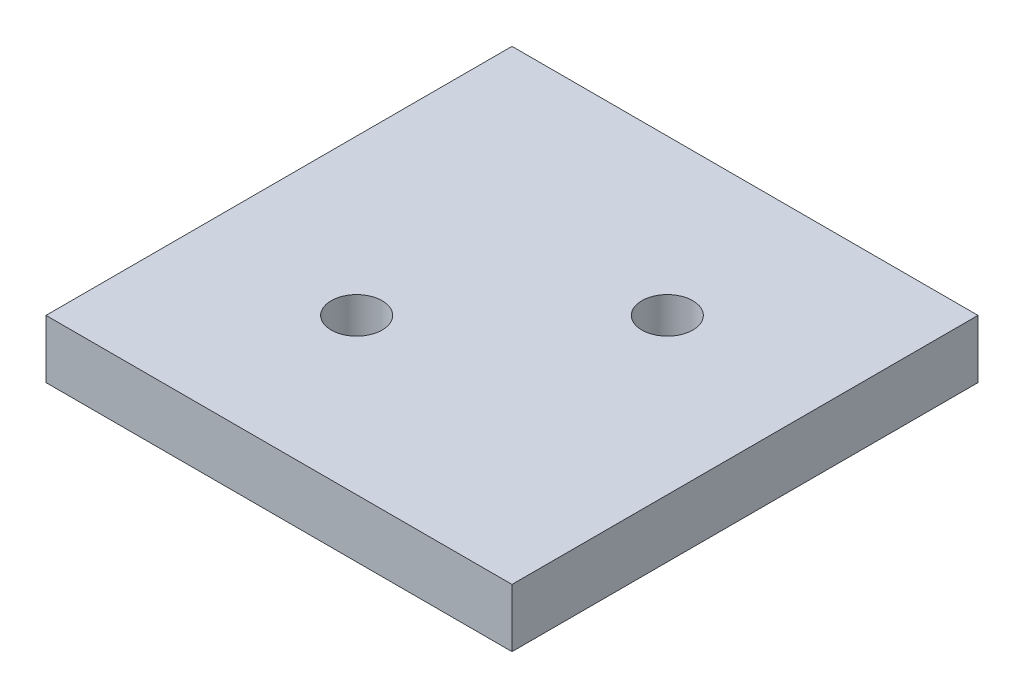
ISO-10303-21;
HEADER;
FILE_DESCRIPTION(('STEP AP214'),'2;1');
FILE_NAME('part.step','',(''),(''),'','','');
FILE_SCHEMA(('AUTOMOTIVE_DESIGN { 1 0 10303 214 1 1 1 1 }'));
ENDSEC;
DATA;
#1=APPLICATION_CONTEXT('core data for automotive mechanical design processes');
#2=APPLICATION_PROTOCOL_DEFINITION('international standard','automotive_design',2000,#1);
#3=PRODUCT_CONTEXT('',#1,'mechanical');
#4=PRODUCT('Part','Part','',(#3));
#5=PRODUCT_RELATED_PRODUCT_CATEGORY('part','',(#4));
#6=PRODUCT_DEFINITION_FORMATION('','',#4);
#7=PRODUCT_DEFINITION_CONTEXT('part definition',#1,'design');
#8=PRODUCT_DEFINITION('design','',#6,#7);
#9=PRODUCT_DEFINITION_SHAPE('','',#8);
#10=(LENGTH_UNIT() NAMED_UNIT(*) SI_UNIT(.MILLI.,.METRE.));
#11=(NAMED_UNIT(*) PLANE_ANGLE_UNIT() SI_UNIT($,.RADIAN.));
#12=(NAMED_UNIT(*) SI_UNIT($,.STERADIAN.) SOLID_ANGLE_UNIT());
#13=UNCERTAINTY_MEASURE_WITH_UNIT(LENGTH_MEASURE(1.E-05),#10,'distance_accuracy_value','');
#14=(GEOMETRIC_REPRESENTATION_CONTEXT(3) GLOBAL_UNCERTAINTY_ASSIGNED_CONTEXT((#13)) GLOBAL_UNIT_ASSIGNED_CONTEXT((#10,
#11,#12)) REPRESENTATION_CONTEXT('',''));
#15=CARTESIAN_POINT('',(0.,0.,0.));
#16=DIRECTION('',(0.,0.,1.));
#17=DIRECTION('',(1.,0.,0.));
#18=AXIS2_PLACEMENT_3D('',#15,#16,#17);
#19=CARTESIAN_POINT('',(0.,-6.35,0.));
#20=DIRECTION('',(-1.,0.,0.));
#21=DIRECTION('',(0.,0.,1.));
#22=AXIS2_PLACEMENT_3D('',#19,#20,#21);
#23=PLANE('',#22);
#24=DIRECTION('',(0.,0.,1.));
#25=VECTOR('',#24,1.);
#26=CARTESIAN_POINT('',(0.,0.,0.));
#27=LINE('',#26,#25);
#28=CARTESIAN_POINT('',(0.,0.,-50.8));
#29=VERTEX_POINT('',#28);
#30=CARTESIAN_POINT('',(0.,0.,0.));
#31=VERTEX_POINT('',#30);
#32=EDGE_CURVE('E120',#29,#31,#27,.T.);
#33=ORIENTED_EDGE('',*,*,#32,.F.);
#34=DIRECTION('',(0.,1.,0.));
#35=VECTOR('',#34,1.);
#36=CARTESIAN_POINT('',(0.,-6.35,-50.8));
#37=LINE('',#36,#35);
#38=CARTESIAN_POINT('',(0.,-6.35,-50.8));
#39=VERTEX_POINT('',#38);
#40=EDGE_CURVE('E11',#39,#29,#37,.T.);
#41=ORIENTED_EDGE('',*,*,#40,.F.);
#42=DIRECTION('',(0.,0.,1.));
#43=VECTOR('',#42,1.);
#44=CARTESIAN_POINT('',(0.,-6.35,0.));
#45=LINE('',#44,#43);
#46=CARTESIAN_POINT('',(0.,-6.35,0.));
#47=VERTEX_POINT('',#46);
#48=EDGE_CURVE('E110',#39,#47,#45,.T.);
#49=ORIENTED_EDGE('',*,*,#48,.T.);
#50=DIRECTION('',(0.,1.,0.));
#51=VECTOR('',#50,1.);
#52=CARTESIAN_POINT('',(0.,-6.35,0.));
#53=LINE('',#52,#51);
#54=EDGE_CURVE('E43',#47,#31,#53,.T.);
#55=ORIENTED_EDGE('',*,*,#54,.T.);
#56=EDGE_LOOP('',(#33,#41,#49,#55));
#57=FACE_BOUND('',#56,.T.);
#58=ADVANCED_FACE('F40',(#57),#23,.T.);
#59=CARTESIAN_POINT('',(0.,-6.35,-50.8));
#60=DIRECTION('',(0.,0.,-1.));
#61=DIRECTION('',(-1.,0.,0.));
#62=AXIS2_PLACEMENT_3D('',#59,#60,#61);
#63=PLANE('',#62);
#64=DIRECTION('',(-1.,0.,0.));
#65=VECTOR('',#64,1.);
#66=CARTESIAN_POINT('',(0.,0.,-50.8));
#67=LINE('',#66,#65);
#68=CARTESIAN_POINT('',(50.8,0.,-50.8));
#69=VERTEX_POINT('',#68);
#70=EDGE_CURVE('E114',#69,#29,#67,.T.);
#71=ORIENTED_EDGE('',*,*,#70,.F.);
#72=DIRECTION('',(0.,1.,0.));
#73=VECTOR('',#72,1.);
#74=CARTESIAN_POINT('',(50.8,-6.35,-50.8));
#75=LINE('',#74,#73);
#76=CARTESIAN_POINT('',(50.8,-6.35,-50.8));
#77=VERTEX_POINT('',#76);
#78=EDGE_CURVE('E50',#77,#69,#75,.T.);
#79=ORIENTED_EDGE('',*,*,#78,.F.);
#80=DIRECTION('',(-1.,0.,0.));
#81=VECTOR('',#80,1.);
#82=CARTESIAN_POINT('',(0.,-6.35,-50.8));
#83=LINE('',#82,#81);
#84=EDGE_CURVE('E105',#77,#39,#83,.T.);
#85=ORIENTED_EDGE('',*,*,#84,.T.);
#86=ORIENTED_EDGE('',*,*,#40,.T.);
#87=EDGE_LOOP('',(#71,#79,#85,#86));
#88=FACE_BOUND('',#87,.T.);
#89=ADVANCED_FACE('F168',(#88),#63,.T.);
#90=CARTESIAN_POINT('',(50.8,-6.35,0.));
#91=DIRECTION('',(1.,0.,0.));
#92=DIRECTION('',(0.,0.,-1.));
#93=AXIS2_PLACEMENT_3D('',#90,#91,#92);
#94=PLANE('',#93);
#95=DIRECTION('',(0.,0.,-1.));
#96=VECTOR('',#95,1.);
#97=CARTESIAN_POINT('',(50.8,0.,0.));
#98=LINE('',#97,#96);
#99=CARTESIAN_POINT('',(50.8,0.,0.));
#100=VERTEX_POINT('',#99);
#101=EDGE_CURVE('E99',#100,#69,#98,.T.);
#102=ORIENTED_EDGE('',*,*,#101,.F.);
#103=DIRECTION('',(0.,1.,0.));
#104=VECTOR('',#103,1.);
#105=CARTESIAN_POINT('',(50.8,-6.35,0.));
#106=LINE('',#105,#104);
#107=CARTESIAN_POINT('',(50.8,-6.35,0.));
#108=VERTEX_POINT('',#107);
#109=EDGE_CURVE('E94',#108,#100,#106,.T.);
#110=ORIENTED_EDGE('',*,*,#109,.F.);
#111=DIRECTION('',(0.,0.,-1.));
#112=VECTOR('',#111,1.);
#113=CARTESIAN_POINT('',(50.8,-6.35,0.));
#114=LINE('',#113,#112);
#115=EDGE_CURVE('E97',#108,#77,#114,.T.);
#116=ORIENTED_EDGE('',*,*,#115,.T.);
#117=ORIENTED_EDGE('',*,*,#78,.T.);
#118=EDGE_LOOP('',(#102,#110,#116,#117));
#119=FACE_BOUND('',#118,.T.);
#120=ADVANCED_FACE('F96',(#119),#94,.T.);
#121=CARTESIAN_POINT('',(0.,-6.35,0.));
#122=DIRECTION('',(0.,0.,1.));
#123=DIRECTION('',(1.,0.,0.));
#124=AXIS2_PLACEMENT_3D('',#121,#122,#123);
#125=PLANE('',#124);
#126=DIRECTION('',(1.,0.,0.));
#127=VECTOR('',#126,1.);
#128=CARTESIAN_POINT('',(0.,0.,0.));
#129=LINE('',#128,#127);
#130=EDGE_CURVE('E124',#31,#100,#129,.T.);
#131=ORIENTED_EDGE('',*,*,#130,.F.);
#132=ORIENTED_EDGE('',*,*,#54,.F.);
#133=DIRECTION('',(1.,0.,0.));
#134=VECTOR('',#133,1.);
#135=CARTESIAN_POINT('',(0.,-6.35,0.));
#136=LINE('',#135,#134);
#137=EDGE_CURVE('E104',#47,#108,#136,.T.);
#138=ORIENTED_EDGE('',*,*,#137,.T.);
#139=ORIENTED_EDGE('',*,*,#109,.T.);
#140=EDGE_LOOP('',(#131,#132,#138,#139));
#141=FACE_BOUND('',#140,.T.);
#142=ADVANCED_FACE('F108',(#141),#125,.T.);
#143=CARTESIAN_POINT('',(0.,-6.35,0.));
#144=DIRECTION('',(0.,-1.,0.));
#145=DIRECTION('',(0.,0.,-1.));
#146=AXIS2_PLACEMENT_3D('',#143,#144,#145);
#147=PLANE('',#146);
#148=CARTESIAN_POINT('',(33.8666666666667,-6.35,-33.8666666666667));
#149=DIRECTION('',(0.,1.,0.));
#150=DIRECTION('',(0.,0.,1.));
#151=AXIS2_PLACEMENT_3D('',#148,#149,#150);
#152=CIRCLE('',#151,2.778125);
#153=CARTESIAN_POINT('',(33.8666666666667,-6.35,-31.0885416666667));
#154=VERTEX_POINT('',#153);
#155=EDGE_CURVE('E135',#154,#154,#152,.T.);
#156=ORIENTED_EDGE('',*,*,#155,.T.);
#157=EDGE_LOOP('',(#156));
#158=FACE_BOUND('',#157,.T.);
#159=CARTESIAN_POINT('',(16.9333333333335,-6.35,-16.9333333333332));
#160=DIRECTION('',(0.,1.,0.));
#161=DIRECTION('',(0.,0.,1.));
#162=AXIS2_PLACEMENT_3D('',#159,#160,#161);
#163=CIRCLE('',#162,2.778125);
#164=CARTESIAN_POINT('',(16.9333333333335,-6.35,-14.1552083333332));
#165=VERTEX_POINT('',#164);
#166=EDGE_CURVE('E125',#165,#165,#163,.T.);
#167=ORIENTED_EDGE('',*,*,#166,.T.);
#168=EDGE_LOOP('',(#167));
#169=FACE_BOUND('',#168,.T.);
#170=ORIENTED_EDGE('',*,*,#48,.F.);
#171=ORIENTED_EDGE('',*,*,#84,.F.);
#172=ORIENTED_EDGE('',*,*,#115,.F.);
#173=ORIENTED_EDGE('',*,*,#137,.F.);
#174=EDGE_LOOP('',(#170,#171,#172,#173));
#175=FACE_BOUND('',#174,.T.);
#176=ADVANCED_FACE('F103',(#158,#169,#175),#147,.T.);
#177=CARTESIAN_POINT('',(0.,0.,0.));
#178=DIRECTION('',(0.,-1.,0.));
#179=DIRECTION('',(0.,0.,-1.));
#180=AXIS2_PLACEMENT_3D('',#177,#178,#179);
#181=PLANE('',#180);
#182=CARTESIAN_POINT('',(33.8666666666667,0.,-33.8666666666667));
#183=DIRECTION('',(0.,1.,0.));
#184=DIRECTION('',(0.,0.,1.));
#185=AXIS2_PLACEMENT_3D('',#182,#183,#184);
#186=CIRCLE('',#185,2.778125);
#187=CARTESIAN_POINT('',(33.8666666666667,0.,-31.0885416666667));
#188=VERTEX_POINT('',#187);
#189=EDGE_CURVE('E138',#188,#188,#186,.T.);
#190=ORIENTED_EDGE('',*,*,#189,.F.);
#191=EDGE_LOOP('',(#190));
#192=FACE_BOUND('',#191,.T.);
#193=CARTESIAN_POINT('',(16.9333333333335,0.,-16.9333333333332));
#194=DIRECTION('',(0.,1.,0.));
#195=DIRECTION('',(0.,0.,1.));
#196=AXIS2_PLACEMENT_3D('',#193,#194,#195);
#197=CIRCLE('',#196,2.778125);
#198=CARTESIAN_POINT('',(16.9333333333335,0.,-14.1552083333332));
#199=VERTEX_POINT('',#198);
#200=EDGE_CURVE('E137',#199,#199,#197,.T.);
#201=ORIENTED_EDGE('',*,*,#200,.F.);
#202=EDGE_LOOP('',(#201));
#203=FACE_BOUND('',#202,.T.);
#204=ORIENTED_EDGE('',*,*,#32,.T.);
#205=ORIENTED_EDGE('',*,*,#130,.T.);
#206=ORIENTED_EDGE('',*,*,#101,.T.);
#207=ORIENTED_EDGE('',*,*,#70,.T.);
#208=EDGE_LOOP('',(#204,#205,#206,#207));
#209=FACE_BOUND('',#208,.T.);
#210=ADVANCED_FACE('F156',(#192,#203,#209),#181,.F.);
#211=CARTESIAN_POINT('',(16.9333333333335,-6.35,-16.9333333333332));
#212=DIRECTION('',(0.,1.,0.));
#213=DIRECTION('',(0.,0.,1.));
#214=AXIS2_PLACEMENT_3D('',#211,#212,#213);
#215=CYLINDRICAL_SURFACE('',#214,2.778125);
#216=ORIENTED_EDGE('',*,*,#166,.F.);
#217=EDGE_LOOP('',(#216));
#218=FACE_BOUND('',#217,.T.);
#219=ORIENTED_EDGE('',*,*,#200,.T.);
#220=EDGE_LOOP('',(#219));
#221=FACE_BOUND('',#220,.T.);
#222=ADVANCED_FACE('F153',(#218,#221),#215,.F.);
#223=CARTESIAN_POINT('',(33.8666666666667,-6.35,-33.8666666666667));
#224=DIRECTION('',(0.,1.,0.));
#225=DIRECTION('',(0.,0.,1.));
#226=AXIS2_PLACEMENT_3D('',#223,#224,#225);
#227=CYLINDRICAL_SURFACE('',#226,2.778125);
#228=ORIENTED_EDGE('',*,*,#155,.F.);
#229=EDGE_LOOP('',(#228));
#230=FACE_BOUND('',#229,.T.);
#231=ORIENTED_EDGE('',*,*,#189,.T.);
#232=EDGE_LOOP('',(#231));
#233=FACE_BOUND('',#232,.T.);
#234=ADVANCED_FACE('F155',(#230,#233),#227,.F.);
#235=CLOSED_SHELL('',(#58,#89,#120,#142,#176,#210,#222,#234));
#236=MANIFOLD_SOLID_BREP('B2',#235);
#237=ADVANCED_BREP_SHAPE_REPRESENTATION('',(#18,#236),#14);
#238=SHAPE_DEFINITION_REPRESENTATION(#9,#237);
ENDSEC;
END-ISO-10303-21;
